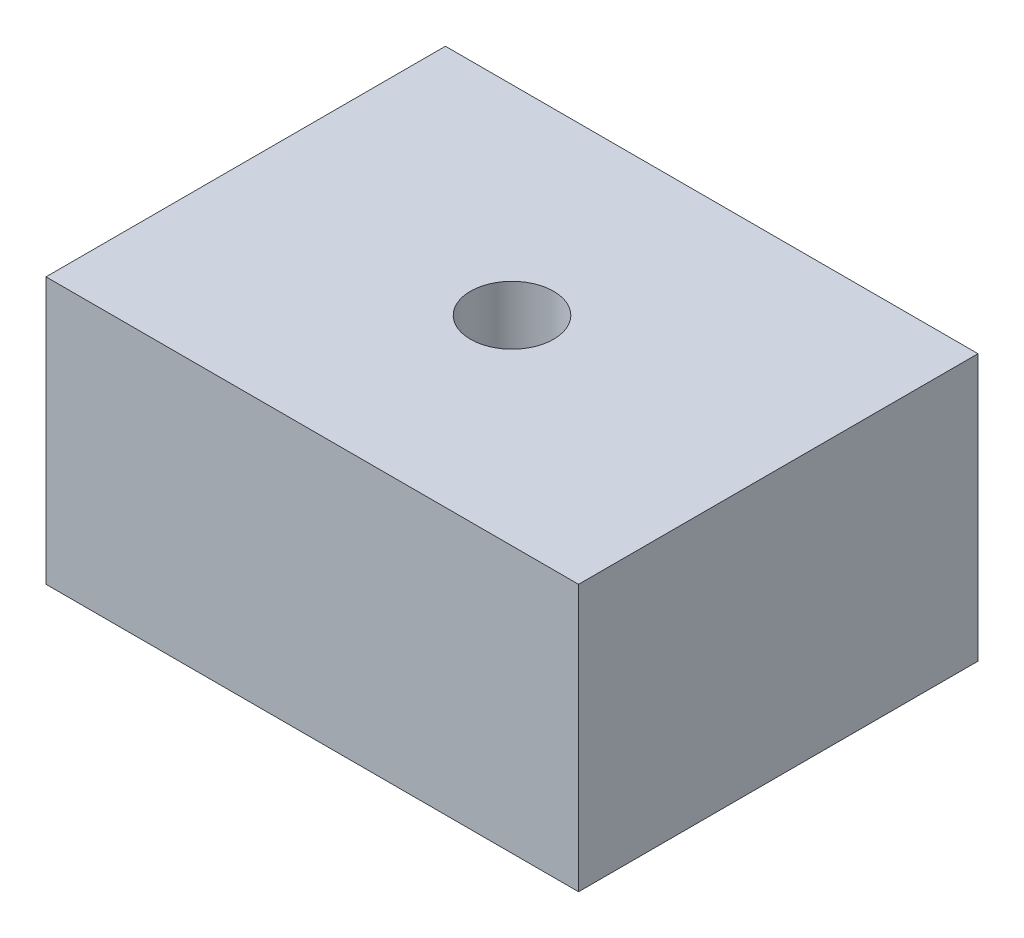
ISO-10303-21;
HEADER;
FILE_DESCRIPTION(('STEP AP214'),'2;1');
FILE_NAME('part.step','',(''),(''),'','','');
FILE_SCHEMA(('AUTOMOTIVE_DESIGN { 1 0 10303 214 1 1 1 1 }'));
ENDSEC;
DATA;
#1=APPLICATION_CONTEXT('core data for automotive mechanical design processes');
#2=APPLICATION_PROTOCOL_DEFINITION('international standard','automotive_design',2000,#1);
#3=PRODUCT_CONTEXT('',#1,'mechanical');
#4=PRODUCT('Part','Part','',(#3));
#5=PRODUCT_RELATED_PRODUCT_CATEGORY('part','',(#4));
#6=PRODUCT_DEFINITION_FORMATION('','',#4);
#7=PRODUCT_DEFINITION_CONTEXT('part definition',#1,'design');
#8=PRODUCT_DEFINITION('design','',#6,#7);
#9=PRODUCT_DEFINITION_SHAPE('','',#8);
#10=(LENGTH_UNIT() NAMED_UNIT(*) SI_UNIT(.MILLI.,.METRE.));
#11=(NAMED_UNIT(*) PLANE_ANGLE_UNIT() SI_UNIT($,.RADIAN.));
#12=(NAMED_UNIT(*) SI_UNIT($,.STERADIAN.) SOLID_ANGLE_UNIT());
#13=UNCERTAINTY_MEASURE_WITH_UNIT(LENGTH_MEASURE(1.E-05),#10,'distance_accuracy_value','');
#14=(GEOMETRIC_REPRESENTATION_CONTEXT(3) GLOBAL_UNCERTAINTY_ASSIGNED_CONTEXT((#13)) GLOBAL_UNIT_ASSIGNED_CONTEXT((#10,
#11,#12)) REPRESENTATION_CONTEXT('',''));
#15=CARTESIAN_POINT('',(0.,0.,0.));
#16=DIRECTION('',(0.,0.,1.));
#17=DIRECTION('',(1.,0.,0.));
#18=AXIS2_PLACEMENT_3D('',#15,#16,#17);
#19=CARTESIAN_POINT('',(-50.8,25.4,-38.1));
#20=DIRECTION('',(1.,0.,0.));
#21=DIRECTION('',(0.,0.,-1.));
#22=AXIS2_PLACEMENT_3D('',#19,#20,#21);
#23=PLANE('',#22);
#24=DIRECTION('',(0.,0.,1.));
#25=VECTOR('',#24,1.);
#26=CARTESIAN_POINT('',(-50.8,0.,-38.1));
#27=LINE('',#26,#25);
#28=CARTESIAN_POINT('',(-50.8,0.,-38.1));
#29=VERTEX_POINT('',#28);
#30=CARTESIAN_POINT('',(-50.8,0.,0.));
#31=VERTEX_POINT('',#30);
#32=EDGE_CURVE('E111',#29,#31,#27,.T.);
#33=ORIENTED_EDGE('',*,*,#32,.T.);
#34=DIRECTION('',(0.,-1.,0.));
#35=VECTOR('',#34,1.);
#36=CARTESIAN_POINT('',(-50.8,25.4,0.));
#37=LINE('',#36,#35);
#38=CARTESIAN_POINT('',(-50.8,25.4,0.));
#39=VERTEX_POINT('',#38);
#40=EDGE_CURVE('E11',#39,#31,#37,.T.);
#41=ORIENTED_EDGE('',*,*,#40,.F.);
#42=DIRECTION('',(0.,0.,1.));
#43=VECTOR('',#42,1.);
#44=CARTESIAN_POINT('',(-50.8,25.4,-38.1));
#45=LINE('',#44,#43);
#46=CARTESIAN_POINT('',(-50.8,25.4,-38.1));
#47=VERTEX_POINT('',#46);
#48=EDGE_CURVE('E95',#47,#39,#45,.T.);
#49=ORIENTED_EDGE('',*,*,#48,.F.);
#50=DIRECTION('',(0.,-1.,0.));
#51=VECTOR('',#50,1.);
#52=CARTESIAN_POINT('',(-50.8,25.4,-38.1));
#53=LINE('',#52,#51);
#54=EDGE_CURVE('E107',#47,#29,#53,.T.);
#55=ORIENTED_EDGE('',*,*,#54,.T.);
#56=EDGE_LOOP('',(#33,#41,#49,#55));
#57=FACE_BOUND('',#56,.T.);
#58=ADVANCED_FACE('F43',(#57),#23,.F.);
#59=CARTESIAN_POINT('',(-50.8,25.4,0.));
#60=DIRECTION('',(0.,0.,-1.));
#61=DIRECTION('',(-1.,0.,0.));
#62=AXIS2_PLACEMENT_3D('',#59,#60,#61);
#63=PLANE('',#62);
#64=DIRECTION('',(1.,0.,0.));
#65=VECTOR('',#64,1.);
#66=CARTESIAN_POINT('',(-50.8,0.,0.));
#67=LINE('',#66,#65);
#68=CARTESIAN_POINT('',(0.,0.,0.));
#69=VERTEX_POINT('',#68);
#70=EDGE_CURVE('E100',#31,#69,#67,.T.);
#71=ORIENTED_EDGE('',*,*,#70,.T.);
#72=DIRECTION('',(0.,-1.,0.));
#73=VECTOR('',#72,1.);
#74=CARTESIAN_POINT('',(0.,25.4,0.));
#75=LINE('',#74,#73);
#76=CARTESIAN_POINT('',(0.,25.4,0.));
#77=VERTEX_POINT('',#76);
#78=EDGE_CURVE('E52',#77,#69,#75,.T.);
#79=ORIENTED_EDGE('',*,*,#78,.F.);
#80=DIRECTION('',(1.,0.,0.));
#81=VECTOR('',#80,1.);
#82=CARTESIAN_POINT('',(-50.8,25.4,0.));
#83=LINE('',#82,#81);
#84=EDGE_CURVE('E90',#39,#77,#83,.T.);
#85=ORIENTED_EDGE('',*,*,#84,.F.);
#86=ORIENTED_EDGE('',*,*,#40,.T.);
#87=EDGE_LOOP('',(#71,#79,#85,#86));
#88=FACE_BOUND('',#87,.T.);
#89=ADVANCED_FACE('F99',(#88),#63,.F.);
#90=CARTESIAN_POINT('',(0.,25.4,-38.1));
#91=DIRECTION('',(-1.,0.,0.));
#92=DIRECTION('',(0.,0.,1.));
#93=AXIS2_PLACEMENT_3D('',#90,#91,#92);
#94=PLANE('',#93);
#95=DIRECTION('',(0.,0.,-1.));
#96=VECTOR('',#95,1.);
#97=CARTESIAN_POINT('',(0.,0.,-38.1));
#98=LINE('',#97,#96);
#99=CARTESIAN_POINT('',(0.,0.,-38.1));
#100=VERTEX_POINT('',#99);
#101=EDGE_CURVE('E77',#69,#100,#98,.T.);
#102=ORIENTED_EDGE('',*,*,#101,.T.);
#103=DIRECTION('',(0.,-1.,0.));
#104=VECTOR('',#103,1.);
#105=CARTESIAN_POINT('',(0.,25.4,-38.1));
#106=LINE('',#105,#104);
#107=CARTESIAN_POINT('',(0.,25.4,-38.1));
#108=VERTEX_POINT('',#107);
#109=EDGE_CURVE('E102',#108,#100,#106,.T.);
#110=ORIENTED_EDGE('',*,*,#109,.F.);
#111=DIRECTION('',(0.,0.,-1.));
#112=VECTOR('',#111,1.);
#113=CARTESIAN_POINT('',(0.,25.4,-38.1));
#114=LINE('',#113,#112);
#115=EDGE_CURVE('E93',#77,#108,#114,.T.);
#116=ORIENTED_EDGE('',*,*,#115,.F.);
#117=ORIENTED_EDGE('',*,*,#78,.T.);
#118=EDGE_LOOP('',(#102,#110,#116,#117));
#119=FACE_BOUND('',#118,.T.);
#120=ADVANCED_FACE('F103',(#119),#94,.F.);
#121=CARTESIAN_POINT('',(-50.8,25.4,-38.1));
#122=DIRECTION('',(0.,0.,1.));
#123=DIRECTION('',(1.,0.,0.));
#124=AXIS2_PLACEMENT_3D('',#121,#122,#123);
#125=PLANE('',#124);
#126=DIRECTION('',(-1.,0.,0.));
#127=VECTOR('',#126,1.);
#128=CARTESIAN_POINT('',(-50.8,0.,-38.1));
#129=LINE('',#128,#127);
#130=EDGE_CURVE('E83',#100,#29,#129,.T.);
#131=ORIENTED_EDGE('',*,*,#130,.T.);
#132=ORIENTED_EDGE('',*,*,#54,.F.);
#133=DIRECTION('',(-1.,0.,0.));
#134=VECTOR('',#133,1.);
#135=CARTESIAN_POINT('',(-50.8,25.4,-38.1));
#136=LINE('',#135,#134);
#137=EDGE_CURVE('E60',#108,#47,#136,.T.);
#138=ORIENTED_EDGE('',*,*,#137,.F.);
#139=ORIENTED_EDGE('',*,*,#109,.T.);
#140=EDGE_LOOP('',(#131,#132,#138,#139));
#141=FACE_BOUND('',#140,.T.);
#142=ADVANCED_FACE('F125',(#141),#125,.F.);
#143=CARTESIAN_POINT('',(0.,25.4,0.));
#144=DIRECTION('',(0.,1.,0.));
#145=DIRECTION('',(0.,0.,1.));
#146=AXIS2_PLACEMENT_3D('',#143,#144,#145);
#147=PLANE('',#146);
#148=CARTESIAN_POINT('',(-25.4,25.4,-19.05));
#149=DIRECTION('',(0.,1.,0.));
#150=DIRECTION('',(0.,0.,1.));
#151=AXIS2_PLACEMENT_3D('',#148,#149,#150);
#152=CIRCLE('',#151,3.96874999999999);
#153=CARTESIAN_POINT('',(-25.4,25.4,-15.08125));
#154=VERTEX_POINT('',#153);
#155=EDGE_CURVE('E135',#154,#154,#152,.T.);
#156=ORIENTED_EDGE('',*,*,#155,.F.);
#157=EDGE_LOOP('',(#156));
#158=FACE_BOUND('',#157,.T.);
#159=ORIENTED_EDGE('',*,*,#48,.T.);
#160=ORIENTED_EDGE('',*,*,#84,.T.);
#161=ORIENTED_EDGE('',*,*,#115,.T.);
#162=ORIENTED_EDGE('',*,*,#137,.T.);
#163=EDGE_LOOP('',(#159,#160,#161,#162));
#164=FACE_BOUND('',#163,.T.);
#165=ADVANCED_FACE('F91',(#158,#164),#147,.T.);
#166=CARTESIAN_POINT('',(0.,0.,0.));
#167=DIRECTION('',(0.,1.,0.));
#168=DIRECTION('',(0.,0.,1.));
#169=AXIS2_PLACEMENT_3D('',#166,#167,#168);
#170=PLANE('',#169);
#171=CARTESIAN_POINT('',(-25.4,0.,-19.05));
#172=DIRECTION('',(0.,1.,0.));
#173=DIRECTION('',(0.,0.,1.));
#174=AXIS2_PLACEMENT_3D('',#171,#172,#173);
#175=CIRCLE('',#174,3.96874999999999);
#176=CARTESIAN_POINT('',(-25.4,0.,-15.08125));
#177=VERTEX_POINT('',#176);
#178=EDGE_CURVE('E115',#177,#177,#175,.T.);
#179=ORIENTED_EDGE('',*,*,#178,.T.);
#180=EDGE_LOOP('',(#179));
#181=FACE_BOUND('',#180,.T.);
#182=ORIENTED_EDGE('',*,*,#32,.F.);
#183=ORIENTED_EDGE('',*,*,#130,.F.);
#184=ORIENTED_EDGE('',*,*,#101,.F.);
#185=ORIENTED_EDGE('',*,*,#70,.F.);
#186=EDGE_LOOP('',(#182,#183,#184,#185));
#187=FACE_BOUND('',#186,.T.);
#188=ADVANCED_FACE('F128',(#181,#187),#170,.F.);
#189=CARTESIAN_POINT('',(-25.4,25.4,-19.05));
#190=DIRECTION('',(0.,1.,0.));
#191=DIRECTION('',(0.,0.,1.));
#192=AXIS2_PLACEMENT_3D('',#189,#190,#191);
#193=CYLINDRICAL_SURFACE('',#192,3.96874999999999);
#194=ORIENTED_EDGE('',*,*,#178,.F.);
#195=EDGE_LOOP('',(#194));
#196=FACE_BOUND('',#195,.T.);
#197=ORIENTED_EDGE('',*,*,#155,.T.);
#198=EDGE_LOOP('',(#197));
#199=FACE_BOUND('',#198,.T.);
#200=ADVANCED_FACE('F140',(#196,#199),#193,.F.);
#201=CLOSED_SHELL('',(#58,#89,#120,#142,#165,#188,#200));
#202=MANIFOLD_SOLID_BREP('B2',#201);
#203=ADVANCED_BREP_SHAPE_REPRESENTATION('',(#18,#202),#14);
#204=SHAPE_DEFINITION_REPRESENTATION(#9,#203);
ENDSEC;
END-ISO-10303-21;
